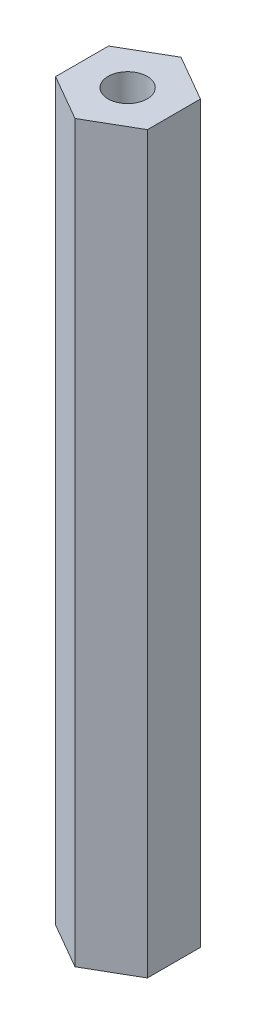
ISO-10303-21;
HEADER;
FILE_DESCRIPTION(('STEP AP214'),'2;1');
FILE_NAME('part.step','',(''),(''),'','','');
FILE_SCHEMA(('AUTOMOTIVE_DESIGN { 1 0 10303 214 1 1 1 1 }'));
ENDSEC;
DATA;
#1=APPLICATION_CONTEXT('core data for automotive mechanical design processes');
#2=APPLICATION_PROTOCOL_DEFINITION('international standard','automotive_design',2000,#1);
#3=PRODUCT_CONTEXT('',#1,'mechanical');
#4=PRODUCT('Part','Part','',(#3));
#5=PRODUCT_RELATED_PRODUCT_CATEGORY('part','',(#4));
#6=PRODUCT_DEFINITION_FORMATION('','',#4);
#7=PRODUCT_DEFINITION_CONTEXT('part definition',#1,'design');
#8=PRODUCT_DEFINITION('design','',#6,#7);
#9=PRODUCT_DEFINITION_SHAPE('','',#8);
#10=(LENGTH_UNIT() NAMED_UNIT(*) SI_UNIT(.MILLI.,.METRE.));
#11=(NAMED_UNIT(*) PLANE_ANGLE_UNIT() SI_UNIT($,.RADIAN.));
#12=(NAMED_UNIT(*) SI_UNIT($,.STERADIAN.) SOLID_ANGLE_UNIT());
#13=UNCERTAINTY_MEASURE_WITH_UNIT(LENGTH_MEASURE(1.E-05),#10,'distance_accuracy_value','');
#14=(GEOMETRIC_REPRESENTATION_CONTEXT(3) GLOBAL_UNCERTAINTY_ASSIGNED_CONTEXT((#13)) GLOBAL_UNIT_ASSIGNED_CONTEXT((#10,
#11,#12)) REPRESENTATION_CONTEXT('',''));
#15=CARTESIAN_POINT('',(0.,0.,0.));
#16=DIRECTION('',(0.,0.,1.));
#17=DIRECTION('',(1.,0.,0.));
#18=AXIS2_PLACEMENT_3D('',#15,#16,#17);
#19=CARTESIAN_POINT('',(3.175,50.8,1.83308710467706));
#20=DIRECTION('',(-1.,0.,0.));
#21=DIRECTION('',(0.,0.,1.));
#22=AXIS2_PLACEMENT_3D('',#19,#20,#21);
#23=PLANE('',#22);
#24=DIRECTION('',(0.,0.,-1.));
#25=VECTOR('',#24,1.);
#26=CARTESIAN_POINT('',(3.175,0.,1.83308710467706));
#27=LINE('',#26,#25);
#28=CARTESIAN_POINT('',(3.175,0.,1.83308710467706));
#29=VERTEX_POINT('',#28);
#30=CARTESIAN_POINT('',(3.175,0.,-1.83308710467706));
#31=VERTEX_POINT('',#30);
#32=EDGE_CURVE('E124',#29,#31,#27,.T.);
#33=ORIENTED_EDGE('',*,*,#32,.T.);
#34=DIRECTION('',(0.,-1.,0.));
#35=VECTOR('',#34,1.);
#36=CARTESIAN_POINT('',(3.175,50.8,-1.83308710467706));
#37=LINE('',#36,#35);
#38=CARTESIAN_POINT('',(3.175,50.8,-1.83308710467706));
#39=VERTEX_POINT('',#38);
#40=EDGE_CURVE('E11',#39,#31,#37,.T.);
#41=ORIENTED_EDGE('',*,*,#40,.F.);
#42=DIRECTION('',(0.,0.,-1.));
#43=VECTOR('',#42,1.);
#44=CARTESIAN_POINT('',(3.175,50.8,1.83308710467706));
#45=LINE('',#44,#43);
#46=CARTESIAN_POINT('',(3.175,50.8,1.83308710467706));
#47=VERTEX_POINT('',#46);
#48=EDGE_CURVE('E135',#47,#39,#45,.T.);
#49=ORIENTED_EDGE('',*,*,#48,.F.);
#50=DIRECTION('',(0.,-1.,0.));
#51=VECTOR('',#50,1.);
#52=CARTESIAN_POINT('',(3.175,50.8,1.83308710467706));
#53=LINE('',#52,#51);
#54=EDGE_CURVE('E120',#47,#29,#53,.T.);
#55=ORIENTED_EDGE('',*,*,#54,.T.);
#56=EDGE_LOOP('',(#33,#41,#49,#55));
#57=FACE_BOUND('',#56,.T.);
#58=ADVANCED_FACE('F37',(#57),#23,.F.);
#59=CARTESIAN_POINT('',(3.175,50.8,-1.83308710467706));
#60=DIRECTION('',(-0.5,0.,0.866025403784439));
#61=DIRECTION('',(0.866025403784439,0.,0.5));
#62=AXIS2_PLACEMENT_3D('',#59,#60,#61);
#63=PLANE('',#62);
#64=DIRECTION('',(-0.866025403784439,0.,-0.5));
#65=VECTOR('',#64,1.);
#66=CARTESIAN_POINT('',(3.175,0.,-1.83308710467706));
#67=LINE('',#66,#65);
#68=CARTESIAN_POINT('',(0.,0.,-3.66617420935412));
#69=VERTEX_POINT('',#68);
#70=EDGE_CURVE('E127',#31,#69,#67,.T.);
#71=ORIENTED_EDGE('',*,*,#70,.T.);
#72=DIRECTION('',(0.,-1.,0.));
#73=VECTOR('',#72,1.);
#74=CARTESIAN_POINT('',(0.,50.8,-3.66617420935412));
#75=LINE('',#74,#73);
#76=CARTESIAN_POINT('',(0.,50.8,-3.66617420935412));
#77=VERTEX_POINT('',#76);
#78=EDGE_CURVE('E45',#77,#69,#75,.T.);
#79=ORIENTED_EDGE('',*,*,#78,.F.);
#80=DIRECTION('',(-0.866025403784439,0.,-0.5));
#81=VECTOR('',#80,1.);
#82=CARTESIAN_POINT('',(3.175,50.8,-1.83308710467706));
#83=LINE('',#82,#81);
#84=EDGE_CURVE('E91',#39,#77,#83,.T.);
#85=ORIENTED_EDGE('',*,*,#84,.F.);
#86=ORIENTED_EDGE('',*,*,#40,.T.);
#87=EDGE_LOOP('',(#71,#79,#85,#86));
#88=FACE_BOUND('',#87,.T.);
#89=ADVANCED_FACE('F160',(#88),#63,.F.);
#90=CARTESIAN_POINT('',(0.,50.8,-3.66617420935412));
#91=DIRECTION('',(0.5,0.,0.866025403784438));
#92=DIRECTION('',(0.866025403784438,0.,-0.5));
#93=AXIS2_PLACEMENT_3D('',#90,#91,#92);
#94=PLANE('',#93);
#95=DIRECTION('',(-0.866025403784438,0.,0.5));
#96=VECTOR('',#95,1.);
#97=CARTESIAN_POINT('',(0.,0.,-3.66617420935412));
#98=LINE('',#97,#96);
#99=CARTESIAN_POINT('',(-3.175,0.,-1.83308710467706));
#100=VERTEX_POINT('',#99);
#101=EDGE_CURVE('E130',#69,#100,#98,.T.);
#102=ORIENTED_EDGE('',*,*,#101,.T.);
#103=DIRECTION('',(0.,-1.,0.));
#104=VECTOR('',#103,1.);
#105=CARTESIAN_POINT('',(-3.175,50.8,-1.83308710467706));
#106=LINE('',#105,#104);
#107=CARTESIAN_POINT('',(-3.175,50.8,-1.83308710467706));
#108=VERTEX_POINT('',#107);
#109=EDGE_CURVE('E115',#108,#100,#106,.T.);
#110=ORIENTED_EDGE('',*,*,#109,.F.);
#111=DIRECTION('',(-0.866025403784438,0.,0.5));
#112=VECTOR('',#111,1.);
#113=CARTESIAN_POINT('',(0.,50.8,-3.66617420935412));
#114=LINE('',#113,#112);
#115=EDGE_CURVE('E106',#77,#108,#114,.T.);
#116=ORIENTED_EDGE('',*,*,#115,.F.);
#117=ORIENTED_EDGE('',*,*,#78,.T.);
#118=EDGE_LOOP('',(#102,#110,#116,#117));
#119=FACE_BOUND('',#118,.T.);
#120=ADVANCED_FACE('F141',(#119),#94,.F.);
#121=CARTESIAN_POINT('',(-3.175,50.8,-1.83308710467706));
#122=DIRECTION('',(1.,0.,0.));
#123=DIRECTION('',(0.,0.,-1.));
#124=AXIS2_PLACEMENT_3D('',#121,#122,#123);
#125=PLANE('',#124);
#126=DIRECTION('',(0.,0.,1.));
#127=VECTOR('',#126,1.);
#128=CARTESIAN_POINT('',(-3.175,0.,-1.83308710467706));
#129=LINE('',#128,#127);
#130=CARTESIAN_POINT('',(-3.175,0.,1.83308710467707));
#131=VERTEX_POINT('',#130);
#132=EDGE_CURVE('E114',#100,#131,#129,.T.);
#133=ORIENTED_EDGE('',*,*,#132,.T.);
#134=DIRECTION('',(0.,-1.,0.));
#135=VECTOR('',#134,1.);
#136=CARTESIAN_POINT('',(-3.175,50.8,1.83308710467707));
#137=LINE('',#136,#135);
#138=CARTESIAN_POINT('',(-3.175,50.8,1.83308710467707));
#139=VERTEX_POINT('',#138);
#140=EDGE_CURVE('E111',#139,#131,#137,.T.);
#141=ORIENTED_EDGE('',*,*,#140,.F.);
#142=DIRECTION('',(0.,0.,1.));
#143=VECTOR('',#142,1.);
#144=CARTESIAN_POINT('',(-3.175,50.8,-1.83308710467706));
#145=LINE('',#144,#143);
#146=EDGE_CURVE('E100',#108,#139,#145,.T.);
#147=ORIENTED_EDGE('',*,*,#146,.F.);
#148=ORIENTED_EDGE('',*,*,#109,.T.);
#149=EDGE_LOOP('',(#133,#141,#147,#148));
#150=FACE_BOUND('',#149,.T.);
#151=ADVANCED_FACE('F112',(#150),#125,.F.);
#152=CARTESIAN_POINT('',(-3.175,50.8,1.83308710467707));
#153=DIRECTION('',(0.5,0.,-0.866025403784439));
#154=DIRECTION('',(-0.866025403784439,0.,-0.5));
#155=AXIS2_PLACEMENT_3D('',#152,#153,#154);
#156=PLANE('',#155);
#157=DIRECTION('',(0.866025403784439,0.,0.5));
#158=VECTOR('',#157,1.);
#159=CARTESIAN_POINT('',(-3.175,0.,1.83308710467707));
#160=LINE('',#159,#158);
#161=CARTESIAN_POINT('',(0.,0.,3.66617420935413));
#162=VERTEX_POINT('',#161);
#163=EDGE_CURVE('E77',#131,#162,#160,.T.);
#164=ORIENTED_EDGE('',*,*,#163,.T.);
#165=DIRECTION('',(0.,-1.,0.));
#166=VECTOR('',#165,1.);
#167=CARTESIAN_POINT('',(0.,50.8,3.66617420935413));
#168=LINE('',#167,#166);
#169=CARTESIAN_POINT('',(0.,50.8,3.66617420935413));
#170=VERTEX_POINT('',#169);
#171=EDGE_CURVE('E116',#170,#162,#168,.T.);
#172=ORIENTED_EDGE('',*,*,#171,.F.);
#173=DIRECTION('',(0.866025403784439,0.,0.5));
#174=VECTOR('',#173,1.);
#175=CARTESIAN_POINT('',(-3.175,50.8,1.83308710467707));
#176=LINE('',#175,#174);
#177=EDGE_CURVE('E104',#139,#170,#176,.T.);
#178=ORIENTED_EDGE('',*,*,#177,.F.);
#179=ORIENTED_EDGE('',*,*,#140,.T.);
#180=EDGE_LOOP('',(#164,#172,#178,#179));
#181=FACE_BOUND('',#180,.T.);
#182=ADVANCED_FACE('F118',(#181),#156,.F.);
#183=CARTESIAN_POINT('',(0.,50.8,3.66617420935413));
#184=DIRECTION('',(-0.5,0.,-0.866025403784438));
#185=DIRECTION('',(-0.866025403784438,0.,0.5));
#186=AXIS2_PLACEMENT_3D('',#183,#184,#185);
#187=PLANE('',#186);
#188=DIRECTION('',(0.866025403784438,0.,-0.5));
#189=VECTOR('',#188,1.);
#190=CARTESIAN_POINT('',(0.,0.,3.66617420935413));
#191=LINE('',#190,#189);
#192=EDGE_CURVE('E83',#162,#29,#191,.T.);
#193=ORIENTED_EDGE('',*,*,#192,.T.);
#194=ORIENTED_EDGE('',*,*,#54,.F.);
#195=DIRECTION('',(0.866025403784438,0.,-0.5));
#196=VECTOR('',#195,1.);
#197=CARTESIAN_POINT('',(0.,50.8,3.66617420935413));
#198=LINE('',#197,#196);
#199=EDGE_CURVE('E53',#170,#47,#198,.T.);
#200=ORIENTED_EDGE('',*,*,#199,.F.);
#201=ORIENTED_EDGE('',*,*,#171,.T.);
#202=EDGE_LOOP('',(#193,#194,#200,#201));
#203=FACE_BOUND('',#202,.T.);
#204=ADVANCED_FACE('F148',(#203),#187,.F.);
#205=CARTESIAN_POINT('',(3.175,50.8,-1.83308710467706));
#206=DIRECTION('',(0.,1.,0.));
#207=DIRECTION('',(0.,0.,1.));
#208=AXIS2_PLACEMENT_3D('',#205,#206,#207);
#209=PLANE('',#208);
#210=CARTESIAN_POINT('',(-0.0235442909612971,50.8,0.00241452807259179));
#211=DIRECTION('',(0.,1.,0.));
#212=DIRECTION('',(0.,0.,1.));
#213=AXIS2_PLACEMENT_3D('',#210,#211,#212);
#214=CIRCLE('',#213,1.35255);
#215=CARTESIAN_POINT('',(-0.0235442909612971,50.8,1.35496452807259));
#216=VERTEX_POINT('',#215);
#217=EDGE_CURVE('E256',#216,#216,#214,.T.);
#218=ORIENTED_EDGE('',*,*,#217,.F.);
#219=EDGE_LOOP('',(#218));
#220=FACE_BOUND('',#219,.T.);
#221=ORIENTED_EDGE('',*,*,#48,.T.);
#222=ORIENTED_EDGE('',*,*,#84,.T.);
#223=ORIENTED_EDGE('',*,*,#115,.T.);
#224=ORIENTED_EDGE('',*,*,#146,.T.);
#225=ORIENTED_EDGE('',*,*,#177,.T.);
#226=ORIENTED_EDGE('',*,*,#199,.T.);
#227=EDGE_LOOP('',(#221,#222,#223,#224,#225,#226));
#228=FACE_BOUND('',#227,.T.);
#229=ADVANCED_FACE('F102',(#220,#228),#209,.T.);
#230=CARTESIAN_POINT('',(3.175,0.,-1.83308710467706));
#231=DIRECTION('',(0.,1.,0.));
#232=DIRECTION('',(0.,0.,1.));
#233=AXIS2_PLACEMENT_3D('',#230,#231,#232);
#234=PLANE('',#233);
#235=CARTESIAN_POINT('',(0.0210720494919769,0.,0.0735381086940379));
#236=DIRECTION('',(0.,-1.,0.));
#237=DIRECTION('',(0.,0.,-1.));
#238=AXIS2_PLACEMENT_3D('',#235,#236,#237);
#239=CIRCLE('',#238,1.35255);
#240=CARTESIAN_POINT('',(0.0210720494919769,0.,-1.27901189130596));
#241=VERTEX_POINT('',#240);
#242=EDGE_CURVE('E254',#241,#241,#239,.T.);
#243=ORIENTED_EDGE('',*,*,#242,.F.);
#244=EDGE_LOOP('',(#243));
#245=FACE_BOUND('',#244,.T.);
#246=ORIENTED_EDGE('',*,*,#32,.F.);
#247=ORIENTED_EDGE('',*,*,#192,.F.);
#248=ORIENTED_EDGE('',*,*,#163,.F.);
#249=ORIENTED_EDGE('',*,*,#132,.F.);
#250=ORIENTED_EDGE('',*,*,#101,.F.);
#251=ORIENTED_EDGE('',*,*,#70,.F.);
#252=EDGE_LOOP('',(#246,#247,#248,#249,#250,#251));
#253=FACE_BOUND('',#252,.T.);
#254=ADVANCED_FACE('F144',(#245,#253),#234,.F.);
#255=CARTESIAN_POINT('',(-0.0235442909612971,41.402,0.00241452807259179));
#256=DIRECTION('',(0.,1.,0.));
#257=DIRECTION('',(0.,0.,1.));
#258=AXIS2_PLACEMENT_3D('',#255,#256,#257);
#259=CONICAL_SURFACE('',#258,1.35255,1.02974425867665);
#260=CARTESIAN_POINT('',(-0.0235442909612996,40.5893059697343,0.00241452807259179));
#261=VERTEX_POINT('',#260);
#262=VERTEX_LOOP('',#261);
#263=FACE_BOUND('',#262,.T.);
#264=CARTESIAN_POINT('',(-0.0235442909612971,41.402,0.00241452807259179));
#265=DIRECTION('',(0.,1.,0.));
#266=DIRECTION('',(0.,0.,1.));
#267=AXIS2_PLACEMENT_3D('',#264,#265,#266);
#268=CIRCLE('',#267,1.35255);
#269=CARTESIAN_POINT('',(-0.0235442909612971,41.402,1.35496452807259));
#270=VERTEX_POINT('',#269);
#271=EDGE_CURVE('E128',#270,#270,#268,.T.);
#272=ORIENTED_EDGE('',*,*,#271,.T.);
#273=EDGE_LOOP('',(#272));
#274=FACE_BOUND('',#273,.T.);
#275=ADVANCED_FACE('F195',(#263,#274),#259,.F.);
#276=CARTESIAN_POINT('',(-0.0235442909612971,50.8,0.00241452807259179));
#277=DIRECTION('',(0.,1.,0.));
#278=DIRECTION('',(0.,0.,1.));
#279=AXIS2_PLACEMENT_3D('',#276,#277,#278);
#280=CYLINDRICAL_SURFACE('',#279,1.35255);
#281=ORIENTED_EDGE('',*,*,#271,.F.);
#282=EDGE_LOOP('',(#281));
#283=FACE_BOUND('',#282,.T.);
#284=ORIENTED_EDGE('',*,*,#217,.T.);
#285=EDGE_LOOP('',(#284));
#286=FACE_BOUND('',#285,.T.);
#287=ADVANCED_FACE('F200',(#283,#286),#280,.F.);
#288=CARTESIAN_POINT('',(0.0210720494919769,9.398,0.0735381086940379));
#289=DIRECTION('',(0.,-1.,0.));
#290=DIRECTION('',(0.,0.,-1.));
#291=AXIS2_PLACEMENT_3D('',#288,#289,#290);
#292=CONICAL_SURFACE('',#291,1.35255,1.02974425867665);
#293=CARTESIAN_POINT('',(0.0210720494919743,10.2106940302657,0.0735381086940379));
#294=VERTEX_POINT('',#293);
#295=VERTEX_LOOP('',#294);
#296=FACE_BOUND('',#295,.T.);
#297=CARTESIAN_POINT('',(0.0210720494919769,9.398,0.0735381086940379));
#298=DIRECTION('',(0.,-1.,0.));
#299=DIRECTION('',(0.,0.,-1.));
#300=AXIS2_PLACEMENT_3D('',#297,#298,#299);
#301=CIRCLE('',#300,1.35255);
#302=CARTESIAN_POINT('',(0.0210720494919769,9.398,-1.27901189130596));
#303=VERTEX_POINT('',#302);
#304=EDGE_CURVE('E251',#303,#303,#301,.T.);
#305=ORIENTED_EDGE('',*,*,#304,.T.);
#306=EDGE_LOOP('',(#305));
#307=FACE_BOUND('',#306,.T.);
#308=ADVANCED_FACE('F211',(#296,#307),#292,.F.);
#309=CARTESIAN_POINT('',(0.0210720494919769,0.,0.0735381086940379));
#310=DIRECTION('',(0.,-1.,0.));
#311=DIRECTION('',(0.,0.,-1.));
#312=AXIS2_PLACEMENT_3D('',#309,#310,#311);
#313=CYLINDRICAL_SURFACE('',#312,1.35255);
#314=ORIENTED_EDGE('',*,*,#304,.F.);
#315=EDGE_LOOP('',(#314));
#316=FACE_BOUND('',#315,.T.);
#317=ORIENTED_EDGE('',*,*,#242,.T.);
#318=EDGE_LOOP('',(#317));
#319=FACE_BOUND('',#318,.T.);
#320=ADVANCED_FACE('F229',(#316,#319),#313,.F.);
#321=CLOSED_SHELL('',(#58,#89,#120,#151,#182,#204,#229,#254,#275,#287,#308,#320));
#322=MANIFOLD_SOLID_BREP('B2',#321);
#323=ADVANCED_BREP_SHAPE_REPRESENTATION('',(#18,#322),#14);
#324=SHAPE_DEFINITION_REPRESENTATION(#9,#323);
ENDSEC;
END-ISO-10303-21;
